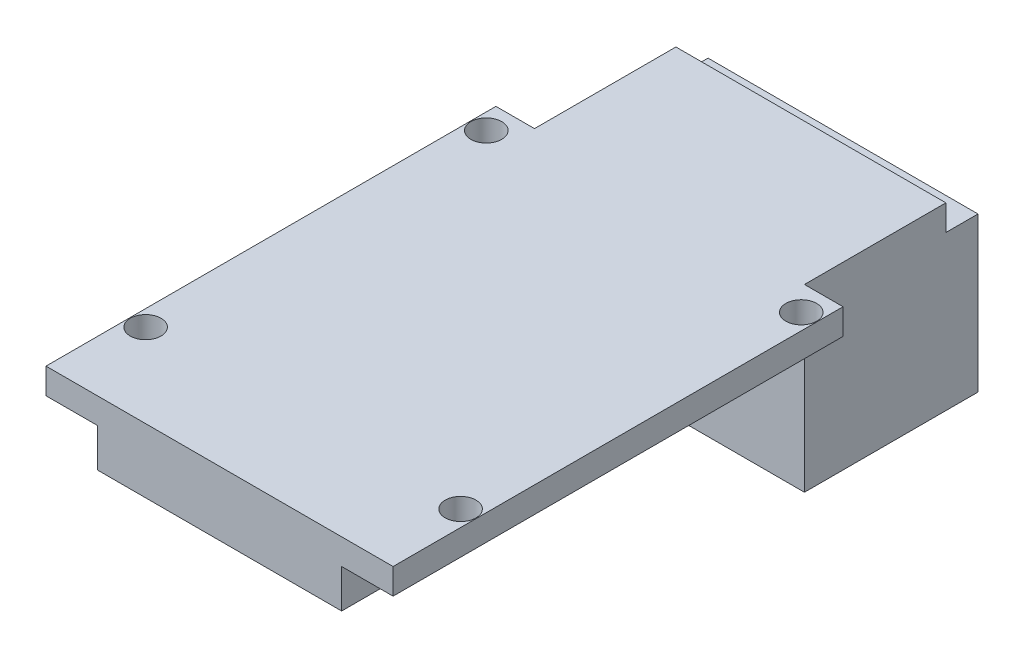
ISO-10303-21;
HEADER;
FILE_DESCRIPTION(('STEP AP214'),'2;1');
FILE_NAME('part.step','',(''),(''),'','','');
FILE_SCHEMA(('AUTOMOTIVE_DESIGN { 1 0 10303 214 1 1 1 1 }'));
ENDSEC;
DATA;
#1=APPLICATION_CONTEXT('core data for automotive mechanical design processes');
#2=APPLICATION_PROTOCOL_DEFINITION('international standard','automotive_design',2000,#1);
#3=PRODUCT_CONTEXT('',#1,'mechanical');
#4=PRODUCT('Part','Part','',(#3));
#5=PRODUCT_RELATED_PRODUCT_CATEGORY('part','',(#4));
#6=PRODUCT_DEFINITION_FORMATION('','',#4);
#7=PRODUCT_DEFINITION_CONTEXT('part definition',#1,'design');
#8=PRODUCT_DEFINITION('design','',#6,#7);
#9=PRODUCT_DEFINITION_SHAPE('','',#8);
#10=(LENGTH_UNIT() NAMED_UNIT(*) SI_UNIT(.MILLI.,.METRE.));
#11=(NAMED_UNIT(*) PLANE_ANGLE_UNIT() SI_UNIT($,.RADIAN.));
#12=(NAMED_UNIT(*) SI_UNIT($,.STERADIAN.) SOLID_ANGLE_UNIT());
#13=UNCERTAINTY_MEASURE_WITH_UNIT(LENGTH_MEASURE(1.E-05),#10,'distance_accuracy_value','');
#14=(GEOMETRIC_REPRESENTATION_CONTEXT(3) GLOBAL_UNCERTAINTY_ASSIGNED_CONTEXT((#13)) GLOBAL_UNIT_ASSIGNED_CONTEXT((#10,
#11,#12)) REPRESENTATION_CONTEXT('',''));
#15=CARTESIAN_POINT('',(0.,0.,0.));
#16=DIRECTION('',(0.,0.,1.));
#17=DIRECTION('',(1.,0.,0.));
#18=AXIS2_PLACEMENT_3D('',#15,#16,#17);
#19=CARTESIAN_POINT('',(0.,0.,0.));
#20=DIRECTION('',(0.,-1.,0.));
#21=DIRECTION('',(0.,0.,-1.));
#22=AXIS2_PLACEMENT_3D('',#19,#20,#21);
#23=PLANE('',#22);
#24=CARTESIAN_POINT('',(-3.27417051599355,0.,1.84748304207005));
#25=DIRECTION('',(0.,-1.,0.));
#26=DIRECTION('',(0.,0.,-1.));
#27=AXIS2_PLACEMENT_3D('',#24,#25,#26);
#28=CIRCLE('',#27,6.);
#29=CARTESIAN_POINT('',(-3.27417051599355,0.,-4.15251695792995));
#30=VERTEX_POINT('',#29);
#31=EDGE_CURVE('E380',#30,#30,#28,.T.);
#32=ORIENTED_EDGE('',*,*,#31,.F.);
#33=EDGE_LOOP('',(#32));
#34=FACE_BOUND('',#33,.T.);
#35=CARTESIAN_POINT('',(-12.25,0.,-15.5));
#36=DIRECTION('',(0.,1.,0.));
#37=DIRECTION('',(0.,0.,-1.));
#38=AXIS2_PLACEMENT_3D('',#35,#36,#37);
#39=CIRCLE('',#38,1.2);
#40=CARTESIAN_POINT('',(-12.25,0.,-16.7));
#41=VERTEX_POINT('',#40);
#42=EDGE_CURVE('E202',#41,#41,#39,.T.);
#43=ORIENTED_EDGE('',*,*,#42,.T.);
#44=EDGE_LOOP('',(#43));
#45=FACE_BOUND('',#44,.T.);
#46=CARTESIAN_POINT('',(12.25,0.,11.));
#47=DIRECTION('',(0.,1.,0.));
#48=DIRECTION('',(0.,0.,1.));
#49=AXIS2_PLACEMENT_3D('',#46,#47,#48);
#50=CIRCLE('',#49,1.2);
#51=CARTESIAN_POINT('',(12.25,0.,12.2));
#52=VERTEX_POINT('',#51);
#53=EDGE_CURVE('E214',#52,#52,#50,.T.);
#54=ORIENTED_EDGE('',*,*,#53,.T.);
#55=EDGE_LOOP('',(#54));
#56=FACE_BOUND('',#55,.T.);
#57=CARTESIAN_POINT('',(12.25,0.,-15.5));
#58=DIRECTION('',(0.,1.,0.));
#59=DIRECTION('',(0.,0.,1.));
#60=AXIS2_PLACEMENT_3D('',#57,#58,#59);
#61=CIRCLE('',#60,1.2);
#62=CARTESIAN_POINT('',(12.25,0.,-14.3));
#63=VERTEX_POINT('',#62);
#64=EDGE_CURVE('E208',#63,#63,#61,.T.);
#65=ORIENTED_EDGE('',*,*,#64,.T.);
#66=EDGE_LOOP('',(#65));
#67=FACE_BOUND('',#66,.T.);
#68=CARTESIAN_POINT('',(-12.25,0.,11.));
#69=DIRECTION('',(0.,1.,0.));
#70=DIRECTION('',(0.,0.,-1.));
#71=AXIS2_PLACEMENT_3D('',#68,#69,#70);
#72=CIRCLE('',#71,1.2);
#73=CARTESIAN_POINT('',(-12.25,0.,9.8));
#74=VERTEX_POINT('',#73);
#75=EDGE_CURVE('E198',#74,#74,#72,.T.);
#76=ORIENTED_EDGE('',*,*,#75,.T.);
#77=EDGE_LOOP('',(#76));
#78=FACE_BOUND('',#77,.T.);
#79=DIRECTION('',(1.,0.,0.));
#80=VECTOR('',#79,1.);
#81=CARTESIAN_POINT('',(9.5,0.,13.5));
#82=LINE('',#81,#80);
#83=CARTESIAN_POINT('',(-9.5,0.,13.5));
#84=VERTEX_POINT('',#83);
#85=CARTESIAN_POINT('',(9.5,0.,13.5));
#86=VERTEX_POINT('',#85);
#87=EDGE_CURVE('E375',#84,#86,#82,.T.);
#88=ORIENTED_EDGE('',*,*,#87,.F.);
#89=DIRECTION('',(0.,0.,-1.));
#90=VECTOR('',#89,1.);
#91=CARTESIAN_POINT('',(-9.5,0.,13.5));
#92=LINE('',#91,#90);
#93=CARTESIAN_POINT('',(-9.5,0.,17.5));
#94=VERTEX_POINT('',#93);
#95=EDGE_CURVE('E298',#94,#84,#92,.T.);
#96=ORIENTED_EDGE('',*,*,#95,.F.);
#97=DIRECTION('',(1.,0.,0.));
#98=VECTOR('',#97,1.);
#99=CARTESIAN_POINT('',(-13.5,0.,17.5));
#100=LINE('',#99,#98);
#101=CARTESIAN_POINT('',(-13.5,0.,17.5));
#102=VERTEX_POINT('',#101);
#103=EDGE_CURVE('E156',#102,#94,#100,.T.);
#104=ORIENTED_EDGE('',*,*,#103,.F.);
#105=DIRECTION('',(0.,0.,1.));
#106=VECTOR('',#105,1.);
#107=CARTESIAN_POINT('',(-13.5,0.,17.5));
#108=LINE('',#107,#106);
#109=CARTESIAN_POINT('',(-13.5,0.,-17.5));
#110=VERTEX_POINT('',#109);
#111=EDGE_CURVE('E154',#110,#102,#108,.T.);
#112=ORIENTED_EDGE('',*,*,#111,.F.);
#113=DIRECTION('',(-1.,0.,0.));
#114=VECTOR('',#113,1.);
#115=CARTESIAN_POINT('',(-13.5,0.,-17.5));
#116=LINE('',#115,#114);
#117=CARTESIAN_POINT('',(-10.5,0.,-17.5));
#118=VERTEX_POINT('',#117);
#119=EDGE_CURVE('E131',#118,#110,#116,.T.);
#120=ORIENTED_EDGE('',*,*,#119,.F.);
#121=DIRECTION('',(-1.,0.,0.));
#122=VECTOR('',#121,1.);
#123=CARTESIAN_POINT('',(10.5,0.,-17.5));
#124=LINE('',#123,#122);
#125=CARTESIAN_POINT('',(10.5,0.,-17.5));
#126=VERTEX_POINT('',#125);
#127=EDGE_CURVE('E183',#126,#118,#124,.T.);
#128=ORIENTED_EDGE('',*,*,#127,.F.);
#129=DIRECTION('',(-1.,0.,0.));
#130=VECTOR('',#129,1.);
#131=CARTESIAN_POINT('',(10.5,0.,-17.5));
#132=LINE('',#131,#130);
#133=CARTESIAN_POINT('',(13.5,0.,-17.5));
#134=VERTEX_POINT('',#133);
#135=EDGE_CURVE('E147',#134,#126,#132,.T.);
#136=ORIENTED_EDGE('',*,*,#135,.F.);
#137=DIRECTION('',(0.,0.,-1.));
#138=VECTOR('',#137,1.);
#139=CARTESIAN_POINT('',(13.5,0.,17.5));
#140=LINE('',#139,#138);
#141=CARTESIAN_POINT('',(13.5,0.,17.5));
#142=VERTEX_POINT('',#141);
#143=EDGE_CURVE('E144',#142,#134,#140,.T.);
#144=ORIENTED_EDGE('',*,*,#143,.F.);
#145=CARTESIAN_POINT('',(9.5,0.,17.5));
#146=VERTEX_POINT('',#145);
#147=EDGE_CURVE('E90',#146,#142,#100,.T.);
#148=ORIENTED_EDGE('',*,*,#147,.F.);
#149=DIRECTION('',(0.,0.,1.));
#150=VECTOR('',#149,1.);
#151=CARTESIAN_POINT('',(9.5,0.,13.5));
#152=LINE('',#151,#150);
#153=EDGE_CURVE('E294',#86,#146,#152,.T.);
#154=ORIENTED_EDGE('',*,*,#153,.F.);
#155=EDGE_LOOP('',(#88,#96,#104,#112,#120,#128,#136,#144,#148,#154));
#156=FACE_BOUND('',#155,.T.);
#157=ADVANCED_FACE('F39',(#34,#45,#56,#67,#78,#156),#23,.T.);
#158=CARTESIAN_POINT('',(0.,2.,0.));
#159=DIRECTION('',(0.,-1.,0.));
#160=DIRECTION('',(0.,0.,-1.));
#161=AXIS2_PLACEMENT_3D('',#158,#159,#160);
#162=PLANE('',#161);
#163=DIRECTION('',(0.,0.,-1.));
#164=VECTOR('',#163,1.);
#165=CARTESIAN_POINT('',(13.5,2.,17.5));
#166=LINE('',#165,#164);
#167=CARTESIAN_POINT('',(13.5,2.,17.5));
#168=VERTEX_POINT('',#167);
#169=CARTESIAN_POINT('',(13.5,2.,-17.5));
#170=VERTEX_POINT('',#169);
#171=EDGE_CURVE('E159',#168,#170,#166,.T.);
#172=ORIENTED_EDGE('',*,*,#171,.T.);
#173=DIRECTION('',(-1.,0.,0.));
#174=VECTOR('',#173,1.);
#175=CARTESIAN_POINT('',(10.5,2.,-17.5));
#176=LINE('',#175,#174);
#177=CARTESIAN_POINT('',(10.5,2.,-17.5));
#178=VERTEX_POINT('',#177);
#179=EDGE_CURVE('E98',#170,#178,#176,.T.);
#180=ORIENTED_EDGE('',*,*,#179,.T.);
#181=DIRECTION('',(0.,0.,-1.));
#182=VECTOR('',#181,1.);
#183=CARTESIAN_POINT('',(10.5,2.,-28.5));
#184=LINE('',#183,#182);
#185=CARTESIAN_POINT('',(10.5,2.,-28.5));
#186=VERTEX_POINT('',#185);
#187=EDGE_CURVE('E178',#178,#186,#184,.T.);
#188=ORIENTED_EDGE('',*,*,#187,.T.);
#189=DIRECTION('',(-1.,0.,0.));
#190=VECTOR('',#189,1.);
#191=CARTESIAN_POINT('',(-10.5,2.,-28.5));
#192=LINE('',#191,#190);
#193=CARTESIAN_POINT('',(-10.5,2.,-28.5));
#194=VERTEX_POINT('',#193);
#195=EDGE_CURVE('E224',#186,#194,#192,.T.);
#196=ORIENTED_EDGE('',*,*,#195,.T.);
#197=DIRECTION('',(0.,0.,1.));
#198=VECTOR('',#197,1.);
#199=CARTESIAN_POINT('',(-10.5,2.,-28.5));
#200=LINE('',#199,#198);
#201=CARTESIAN_POINT('',(-10.5,2.,-17.5));
#202=VERTEX_POINT('',#201);
#203=EDGE_CURVE('E122',#194,#202,#200,.T.);
#204=ORIENTED_EDGE('',*,*,#203,.T.);
#205=DIRECTION('',(-1.,0.,0.));
#206=VECTOR('',#205,1.);
#207=CARTESIAN_POINT('',(-13.5,2.,-17.5));
#208=LINE('',#207,#206);
#209=CARTESIAN_POINT('',(-13.5,2.,-17.5));
#210=VERTEX_POINT('',#209);
#211=EDGE_CURVE('E114',#202,#210,#208,.T.);
#212=ORIENTED_EDGE('',*,*,#211,.T.);
#213=DIRECTION('',(0.,0.,1.));
#214=VECTOR('',#213,1.);
#215=CARTESIAN_POINT('',(-13.5,2.,17.5));
#216=LINE('',#215,#214);
#217=CARTESIAN_POINT('',(-13.5,2.,17.5));
#218=VERTEX_POINT('',#217);
#219=EDGE_CURVE('E119',#210,#218,#216,.T.);
#220=ORIENTED_EDGE('',*,*,#219,.T.);
#221=DIRECTION('',(1.,0.,0.));
#222=VECTOR('',#221,1.);
#223=CARTESIAN_POINT('',(-13.5,2.,17.5));
#224=LINE('',#223,#222);
#225=EDGE_CURVE('E63',#218,#168,#224,.T.);
#226=ORIENTED_EDGE('',*,*,#225,.T.);
#227=EDGE_LOOP('',(#172,#180,#188,#196,#204,#212,#220,#226));
#228=FACE_BOUND('',#227,.T.);
#229=CARTESIAN_POINT('',(12.25,2.,11.));
#230=DIRECTION('',(0.,1.,0.));
#231=DIRECTION('',(0.,0.,1.));
#232=AXIS2_PLACEMENT_3D('',#229,#230,#231);
#233=CIRCLE('',#232,1.2);
#234=CARTESIAN_POINT('',(12.25,2.,12.2));
#235=VERTEX_POINT('',#234);
#236=EDGE_CURVE('E148',#235,#235,#233,.T.);
#237=ORIENTED_EDGE('',*,*,#236,.F.);
#238=EDGE_LOOP('',(#237));
#239=FACE_BOUND('',#238,.T.);
#240=CARTESIAN_POINT('',(12.25,2.,-15.5));
#241=DIRECTION('',(0.,1.,0.));
#242=DIRECTION('',(0.,0.,1.));
#243=AXIS2_PLACEMENT_3D('',#240,#241,#242);
#244=CIRCLE('',#243,1.2);
#245=CARTESIAN_POINT('',(12.25,2.,-14.3));
#246=VERTEX_POINT('',#245);
#247=EDGE_CURVE('E211',#246,#246,#244,.T.);
#248=ORIENTED_EDGE('',*,*,#247,.F.);
#249=EDGE_LOOP('',(#248));
#250=FACE_BOUND('',#249,.T.);
#251=CARTESIAN_POINT('',(-12.25,2.,-15.5));
#252=DIRECTION('',(0.,1.,0.));
#253=DIRECTION('',(0.,0.,-1.));
#254=AXIS2_PLACEMENT_3D('',#251,#252,#253);
#255=CIRCLE('',#254,1.2);
#256=CARTESIAN_POINT('',(-12.25,2.,-16.7));
#257=VERTEX_POINT('',#256);
#258=EDGE_CURVE('E205',#257,#257,#255,.T.);
#259=ORIENTED_EDGE('',*,*,#258,.F.);
#260=EDGE_LOOP('',(#259));
#261=FACE_BOUND('',#260,.T.);
#262=CARTESIAN_POINT('',(-12.25,2.,11.));
#263=DIRECTION('',(0.,1.,0.));
#264=DIRECTION('',(0.,0.,-1.));
#265=AXIS2_PLACEMENT_3D('',#262,#263,#264);
#266=CIRCLE('',#265,1.2);
#267=CARTESIAN_POINT('',(-12.25,2.,9.8));
#268=VERTEX_POINT('',#267);
#269=EDGE_CURVE('E199',#268,#268,#266,.T.);
#270=ORIENTED_EDGE('',*,*,#269,.F.);
#271=EDGE_LOOP('',(#270));
#272=FACE_BOUND('',#271,.T.);
#273=ADVANCED_FACE('F116',(#228,#239,#250,#261,#272),#162,.F.);
#274=CARTESIAN_POINT('',(13.5,2.,17.5));
#275=DIRECTION('',(-1.,0.,0.));
#276=DIRECTION('',(0.,0.,1.));
#277=AXIS2_PLACEMENT_3D('',#274,#275,#276);
#278=PLANE('',#277);
#279=ORIENTED_EDGE('',*,*,#143,.T.);
#280=DIRECTION('',(0.,-1.,0.));
#281=VECTOR('',#280,1.);
#282=CARTESIAN_POINT('',(13.5,2.,-17.5));
#283=LINE('',#282,#281);
#284=EDGE_CURVE('E11',#170,#134,#283,.T.);
#285=ORIENTED_EDGE('',*,*,#284,.F.);
#286=ORIENTED_EDGE('',*,*,#171,.F.);
#287=DIRECTION('',(0.,-1.,0.));
#288=VECTOR('',#287,1.);
#289=CARTESIAN_POINT('',(13.5,2.,17.5));
#290=LINE('',#289,#288);
#291=EDGE_CURVE('E140',#168,#142,#290,.T.);
#292=ORIENTED_EDGE('',*,*,#291,.T.);
#293=EDGE_LOOP('',(#279,#285,#286,#292));
#294=FACE_BOUND('',#293,.T.);
#295=ADVANCED_FACE('F41',(#294),#278,.F.);
#296=CARTESIAN_POINT('',(10.5,2.,-17.5));
#297=DIRECTION('',(0.,0.,1.));
#298=DIRECTION('',(1.,0.,0.));
#299=AXIS2_PLACEMENT_3D('',#296,#297,#298);
#300=PLANE('',#299);
#301=ORIENTED_EDGE('',*,*,#135,.T.);
#302=DIRECTION('',(0.,-1.,0.));
#303=VECTOR('',#302,1.);
#304=CARTESIAN_POINT('',(10.5,2.,-17.5));
#305=LINE('',#304,#303);
#306=EDGE_CURVE('E47',#178,#126,#305,.T.);
#307=ORIENTED_EDGE('',*,*,#306,.F.);
#308=ORIENTED_EDGE('',*,*,#179,.F.);
#309=ORIENTED_EDGE('',*,*,#284,.T.);
#310=EDGE_LOOP('',(#301,#307,#308,#309));
#311=FACE_BOUND('',#310,.T.);
#312=ADVANCED_FACE('F364',(#311),#300,.F.);
#313=CARTESIAN_POINT('',(10.5,2.,-28.5));
#314=DIRECTION('',(-1.,0.,0.));
#315=DIRECTION('',(0.,0.,1.));
#316=AXIS2_PLACEMENT_3D('',#313,#314,#315);
#317=PLANE('',#316);
#318=ORIENTED_EDGE('',*,*,#306,.T.);
#319=DIRECTION('',(0.,1.,0.));
#320=VECTOR('',#319,1.);
#321=CARTESIAN_POINT('',(10.5,-12.,-17.5));
#322=LINE('',#321,#320);
#323=CARTESIAN_POINT('',(10.5,-12.,-17.5));
#324=VERTEX_POINT('',#323);
#325=EDGE_CURVE('E175',#324,#126,#322,.T.);
#326=ORIENTED_EDGE('',*,*,#325,.F.);
#327=DIRECTION('',(0.,0.,1.));
#328=VECTOR('',#327,1.);
#329=CARTESIAN_POINT('',(10.5,-12.,-31.));
#330=LINE('',#329,#328);
#331=CARTESIAN_POINT('',(10.5,-12.,-31.));
#332=VERTEX_POINT('',#331);
#333=EDGE_CURVE('E316',#332,#324,#330,.T.);
#334=ORIENTED_EDGE('',*,*,#333,.F.);
#335=DIRECTION('',(0.,1.,0.));
#336=VECTOR('',#335,1.);
#337=CARTESIAN_POINT('',(10.5,-12.,-31.));
#338=LINE('',#337,#336);
#339=CARTESIAN_POINT('',(10.5,0.,-31.));
#340=VERTEX_POINT('',#339);
#341=EDGE_CURVE('E187',#332,#340,#338,.T.);
#342=ORIENTED_EDGE('',*,*,#341,.T.);
#343=DIRECTION('',(0.,0.,1.));
#344=VECTOR('',#343,1.);
#345=CARTESIAN_POINT('',(10.5,0.,-31.));
#346=LINE('',#345,#344);
#347=CARTESIAN_POINT('',(10.5,0.,-28.5));
#348=VERTEX_POINT('',#347);
#349=EDGE_CURVE('E321',#340,#348,#346,.T.);
#350=ORIENTED_EDGE('',*,*,#349,.T.);
#351=DIRECTION('',(0.,-1.,0.));
#352=VECTOR('',#351,1.);
#353=CARTESIAN_POINT('',(10.5,2.,-28.5));
#354=LINE('',#353,#352);
#355=EDGE_CURVE('E166',#186,#348,#354,.T.);
#356=ORIENTED_EDGE('',*,*,#355,.F.);
#357=ORIENTED_EDGE('',*,*,#187,.F.);
#358=EDGE_LOOP('',(#318,#326,#334,#342,#350,#356,#357));
#359=FACE_BOUND('',#358,.T.);
#360=ADVANCED_FACE('F172',(#359),#317,.F.);
#361=CARTESIAN_POINT('',(-10.5,2.,-28.5));
#362=DIRECTION('',(0.,0.,1.));
#363=DIRECTION('',(1.,0.,0.));
#364=AXIS2_PLACEMENT_3D('',#361,#362,#363);
#365=PLANE('',#364);
#366=DIRECTION('',(-1.,0.,0.));
#367=VECTOR('',#366,1.);
#368=CARTESIAN_POINT('',(-10.5,0.,-28.5));
#369=LINE('',#368,#367);
#370=CARTESIAN_POINT('',(-10.5,0.,-28.5));
#371=VERTEX_POINT('',#370);
#372=EDGE_CURVE('E151',#348,#371,#369,.T.);
#373=ORIENTED_EDGE('',*,*,#372,.T.);
#374=DIRECTION('',(0.,-1.,0.));
#375=VECTOR('',#374,1.);
#376=CARTESIAN_POINT('',(-10.5,2.,-28.5));
#377=LINE('',#376,#375);
#378=EDGE_CURVE('E163',#194,#371,#377,.T.);
#379=ORIENTED_EDGE('',*,*,#378,.F.);
#380=ORIENTED_EDGE('',*,*,#195,.F.);
#381=ORIENTED_EDGE('',*,*,#355,.T.);
#382=EDGE_LOOP('',(#373,#379,#380,#381));
#383=FACE_BOUND('',#382,.T.);
#384=ADVANCED_FACE('F228',(#383),#365,.F.);
#385=CARTESIAN_POINT('',(-10.5,2.,-28.5));
#386=DIRECTION('',(1.,0.,0.));
#387=DIRECTION('',(0.,0.,-1.));
#388=AXIS2_PLACEMENT_3D('',#385,#386,#387);
#389=PLANE('',#388);
#390=ORIENTED_EDGE('',*,*,#378,.T.);
#391=DIRECTION('',(0.,0.,-1.));
#392=VECTOR('',#391,1.);
#393=CARTESIAN_POINT('',(-10.5,0.,-31.));
#394=LINE('',#393,#392);
#395=CARTESIAN_POINT('',(-10.5,0.,-31.));
#396=VERTEX_POINT('',#395);
#397=EDGE_CURVE('E309',#371,#396,#394,.T.);
#398=ORIENTED_EDGE('',*,*,#397,.T.);
#399=DIRECTION('',(0.,1.,0.));
#400=VECTOR('',#399,1.);
#401=CARTESIAN_POINT('',(-10.5,-12.,-31.));
#402=LINE('',#401,#400);
#403=CARTESIAN_POINT('',(-10.5,-12.,-31.));
#404=VERTEX_POINT('',#403);
#405=EDGE_CURVE('E191',#404,#396,#402,.T.);
#406=ORIENTED_EDGE('',*,*,#405,.F.);
#407=DIRECTION('',(0.,0.,-1.));
#408=VECTOR('',#407,1.);
#409=CARTESIAN_POINT('',(-10.5,-12.,-31.));
#410=LINE('',#409,#408);
#411=CARTESIAN_POINT('',(-10.5,-12.,-17.5));
#412=VERTEX_POINT('',#411);
#413=EDGE_CURVE('E311',#412,#404,#410,.T.);
#414=ORIENTED_EDGE('',*,*,#413,.F.);
#415=DIRECTION('',(0.,1.,0.));
#416=VECTOR('',#415,1.);
#417=CARTESIAN_POINT('',(-10.5,-12.,-17.5));
#418=LINE('',#417,#416);
#419=EDGE_CURVE('E188',#412,#118,#418,.T.);
#420=ORIENTED_EDGE('',*,*,#419,.T.);
#421=DIRECTION('',(0.,-1.,0.));
#422=VECTOR('',#421,1.);
#423=CARTESIAN_POINT('',(-10.5,2.,-17.5));
#424=LINE('',#423,#422);
#425=EDGE_CURVE('E134',#202,#118,#424,.T.);
#426=ORIENTED_EDGE('',*,*,#425,.F.);
#427=ORIENTED_EDGE('',*,*,#203,.F.);
#428=EDGE_LOOP('',(#390,#398,#406,#414,#420,#426,#427));
#429=FACE_BOUND('',#428,.T.);
#430=ADVANCED_FACE('F233',(#429),#389,.F.);
#431=CARTESIAN_POINT('',(-13.5,2.,-17.5));
#432=DIRECTION('',(0.,0.,1.));
#433=DIRECTION('',(1.,0.,0.));
#434=AXIS2_PLACEMENT_3D('',#431,#432,#433);
#435=PLANE('',#434);
#436=ORIENTED_EDGE('',*,*,#119,.T.);
#437=DIRECTION('',(0.,-1.,0.));
#438=VECTOR('',#437,1.);
#439=CARTESIAN_POINT('',(-13.5,2.,-17.5));
#440=LINE('',#439,#438);
#441=EDGE_CURVE('E128',#210,#110,#440,.T.);
#442=ORIENTED_EDGE('',*,*,#441,.F.);
#443=ORIENTED_EDGE('',*,*,#211,.F.);
#444=ORIENTED_EDGE('',*,*,#425,.T.);
#445=EDGE_LOOP('',(#436,#442,#443,#444));
#446=FACE_BOUND('',#445,.T.);
#447=ADVANCED_FACE('F129',(#446),#435,.F.);
#448=CARTESIAN_POINT('',(-13.5,2.,17.5));
#449=DIRECTION('',(1.,0.,0.));
#450=DIRECTION('',(0.,0.,-1.));
#451=AXIS2_PLACEMENT_3D('',#448,#449,#450);
#452=PLANE('',#451);
#453=ORIENTED_EDGE('',*,*,#111,.T.);
#454=DIRECTION('',(0.,-1.,0.));
#455=VECTOR('',#454,1.);
#456=CARTESIAN_POINT('',(-13.5,2.,17.5));
#457=LINE('',#456,#455);
#458=EDGE_CURVE('E135',#218,#102,#457,.T.);
#459=ORIENTED_EDGE('',*,*,#458,.F.);
#460=ORIENTED_EDGE('',*,*,#219,.F.);
#461=ORIENTED_EDGE('',*,*,#441,.T.);
#462=EDGE_LOOP('',(#453,#459,#460,#461));
#463=FACE_BOUND('',#462,.T.);
#464=ADVANCED_FACE('F137',(#463),#452,.F.);
#465=CARTESIAN_POINT('',(-13.5,2.,17.5));
#466=DIRECTION('',(0.,0.,-1.));
#467=DIRECTION('',(-1.,0.,0.));
#468=AXIS2_PLACEMENT_3D('',#465,#466,#467);
#469=PLANE('',#468);
#470=ORIENTED_EDGE('',*,*,#103,.T.);
#471=DIRECTION('',(0.,1.,0.));
#472=VECTOR('',#471,1.);
#473=CARTESIAN_POINT('',(-9.5,-3.,17.5));
#474=LINE('',#473,#472);
#475=CARTESIAN_POINT('',(-9.5,-3.,17.5));
#476=VERTEX_POINT('',#475);
#477=EDGE_CURVE('E386',#476,#94,#474,.T.);
#478=ORIENTED_EDGE('',*,*,#477,.F.);
#479=DIRECTION('',(-1.,0.,0.));
#480=VECTOR('',#479,1.);
#481=CARTESIAN_POINT('',(9.5,-3.,17.5));
#482=LINE('',#481,#480);
#483=CARTESIAN_POINT('',(9.5,-3.,17.5));
#484=VERTEX_POINT('',#483);
#485=EDGE_CURVE('E291',#484,#476,#482,.T.);
#486=ORIENTED_EDGE('',*,*,#485,.F.);
#487=DIRECTION('',(0.,1.,0.));
#488=VECTOR('',#487,1.);
#489=CARTESIAN_POINT('',(9.5,-3.,17.5));
#490=LINE('',#489,#488);
#491=EDGE_CURVE('E54',#484,#146,#490,.T.);
#492=ORIENTED_EDGE('',*,*,#491,.T.);
#493=ORIENTED_EDGE('',*,*,#147,.T.);
#494=ORIENTED_EDGE('',*,*,#291,.F.);
#495=ORIENTED_EDGE('',*,*,#225,.F.);
#496=ORIENTED_EDGE('',*,*,#458,.T.);
#497=EDGE_LOOP('',(#470,#478,#486,#492,#493,#494,#495,#496));
#498=FACE_BOUND('',#497,.T.);
#499=ADVANCED_FACE('F351',(#498),#469,.F.);
#500=CARTESIAN_POINT('',(12.25,2.,11.));
#501=DIRECTION('',(0.,-1.,0.));
#502=DIRECTION('',(0.,0.,-1.));
#503=AXIS2_PLACEMENT_3D('',#500,#501,#502);
#504=CYLINDRICAL_SURFACE('',#503,1.2);
#505=ORIENTED_EDGE('',*,*,#236,.T.);
#506=EDGE_LOOP('',(#505));
#507=FACE_BOUND('',#506,.T.);
#508=ORIENTED_EDGE('',*,*,#53,.F.);
#509=EDGE_LOOP('',(#508));
#510=FACE_BOUND('',#509,.T.);
#511=ADVANCED_FACE('F354',(#507,#510),#504,.F.);
#512=CARTESIAN_POINT('',(12.25,2.,-15.5));
#513=DIRECTION('',(0.,-1.,0.));
#514=DIRECTION('',(0.,0.,-1.));
#515=AXIS2_PLACEMENT_3D('',#512,#513,#514);
#516=CYLINDRICAL_SURFACE('',#515,1.2);
#517=ORIENTED_EDGE('',*,*,#247,.T.);
#518=EDGE_LOOP('',(#517));
#519=FACE_BOUND('',#518,.T.);
#520=ORIENTED_EDGE('',*,*,#64,.F.);
#521=EDGE_LOOP('',(#520));
#522=FACE_BOUND('',#521,.T.);
#523=ADVANCED_FACE('F435',(#519,#522),#516,.F.);
#524=CARTESIAN_POINT('',(-12.25,2.,-15.5));
#525=DIRECTION('',(0.,-1.,0.));
#526=DIRECTION('',(0.,0.,-1.));
#527=AXIS2_PLACEMENT_3D('',#524,#525,#526);
#528=CYLINDRICAL_SURFACE('',#527,1.2);
#529=ORIENTED_EDGE('',*,*,#258,.T.);
#530=EDGE_LOOP('',(#529));
#531=FACE_BOUND('',#530,.T.);
#532=ORIENTED_EDGE('',*,*,#42,.F.);
#533=EDGE_LOOP('',(#532));
#534=FACE_BOUND('',#533,.T.);
#535=ADVANCED_FACE('F429',(#531,#534),#528,.F.);
#536=CARTESIAN_POINT('',(-12.25,2.,11.));
#537=DIRECTION('',(0.,-1.,0.));
#538=DIRECTION('',(0.,0.,-1.));
#539=AXIS2_PLACEMENT_3D('',#536,#537,#538);
#540=CYLINDRICAL_SURFACE('',#539,1.2);
#541=ORIENTED_EDGE('',*,*,#269,.T.);
#542=EDGE_LOOP('',(#541));
#543=FACE_BOUND('',#542,.T.);
#544=ORIENTED_EDGE('',*,*,#75,.F.);
#545=EDGE_LOOP('',(#544));
#546=FACE_BOUND('',#545,.T.);
#547=ADVANCED_FACE('F424',(#543,#546),#540,.F.);
#548=CARTESIAN_POINT('',(10.5,-12.,-31.));
#549=DIRECTION('',(0.,0.,1.));
#550=DIRECTION('',(1.,0.,0.));
#551=AXIS2_PLACEMENT_3D('',#548,#549,#550);
#552=PLANE('',#551);
#553=CARTESIAN_POINT('',(0.,-6.,-31.));
#554=DIRECTION('',(0.,0.,-1.));
#555=DIRECTION('',(-1.,0.,0.));
#556=AXIS2_PLACEMENT_3D('',#553,#554,#555);
#557=CIRCLE('',#556,4.);
#558=CARTESIAN_POINT('',(-3.99999999999999,-6.,-31.));
#559=VERTEX_POINT('',#558);
#560=EDGE_CURVE('E300',#559,#559,#557,.T.);
#561=ORIENTED_EDGE('',*,*,#560,.F.);
#562=EDGE_LOOP('',(#561));
#563=FACE_BOUND('',#562,.T.);
#564=DIRECTION('',(1.,0.,0.));
#565=VECTOR('',#564,1.);
#566=CARTESIAN_POINT('',(10.5,0.,-31.));
#567=LINE('',#566,#565);
#568=EDGE_CURVE('E246',#396,#340,#567,.T.);
#569=ORIENTED_EDGE('',*,*,#568,.T.);
#570=ORIENTED_EDGE('',*,*,#341,.F.);
#571=DIRECTION('',(1.,0.,0.));
#572=VECTOR('',#571,1.);
#573=CARTESIAN_POINT('',(10.5,-12.,-31.));
#574=LINE('',#573,#572);
#575=EDGE_CURVE('E314',#404,#332,#574,.T.);
#576=ORIENTED_EDGE('',*,*,#575,.F.);
#577=ORIENTED_EDGE('',*,*,#405,.T.);
#578=EDGE_LOOP('',(#569,#570,#576,#577));
#579=FACE_BOUND('',#578,.T.);
#580=ADVANCED_FACE('F327',(#563,#579),#552,.F.);
#581=CARTESIAN_POINT('',(10.5,-12.,-17.5));
#582=DIRECTION('',(0.,0.,-1.));
#583=DIRECTION('',(-1.,0.,0.));
#584=AXIS2_PLACEMENT_3D('',#581,#582,#583);
#585=PLANE('',#584);
#586=ORIENTED_EDGE('',*,*,#127,.T.);
#587=ORIENTED_EDGE('',*,*,#419,.F.);
#588=DIRECTION('',(-1.,0.,0.));
#589=VECTOR('',#588,1.);
#590=CARTESIAN_POINT('',(10.5,-12.,-17.5));
#591=LINE('',#590,#589);
#592=EDGE_CURVE('E186',#324,#412,#591,.T.);
#593=ORIENTED_EDGE('',*,*,#592,.F.);
#594=ORIENTED_EDGE('',*,*,#325,.T.);
#595=EDGE_LOOP('',(#586,#587,#593,#594));
#596=FACE_BOUND('',#595,.T.);
#597=ADVANCED_FACE('F181',(#596),#585,.F.);
#598=CARTESIAN_POINT('',(0.,-12.,0.));
#599=DIRECTION('',(0.,-1.,0.));
#600=DIRECTION('',(0.,0.,-1.));
#601=AXIS2_PLACEMENT_3D('',#598,#599,#600);
#602=PLANE('',#601);
#603=ORIENTED_EDGE('',*,*,#413,.T.);
#604=ORIENTED_EDGE('',*,*,#575,.T.);
#605=ORIENTED_EDGE('',*,*,#333,.T.);
#606=ORIENTED_EDGE('',*,*,#592,.T.);
#607=EDGE_LOOP('',(#603,#604,#605,#606));
#608=FACE_BOUND('',#607,.T.);
#609=ADVANCED_FACE('F329',(#608),#602,.T.);
#610=CARTESIAN_POINT('',(0.,0.,0.));
#611=DIRECTION('',(0.,-1.,0.));
#612=DIRECTION('',(0.,0.,-1.));
#613=AXIS2_PLACEMENT_3D('',#610,#611,#612);
#614=PLANE('',#613);
#615=ORIENTED_EDGE('',*,*,#372,.F.);
#616=ORIENTED_EDGE('',*,*,#349,.F.);
#617=ORIENTED_EDGE('',*,*,#568,.F.);
#618=ORIENTED_EDGE('',*,*,#397,.F.);
#619=EDGE_LOOP('',(#615,#616,#617,#618));
#620=FACE_BOUND('',#619,.T.);
#621=ADVANCED_FACE('F325',(#620),#614,.F.);
#622=CARTESIAN_POINT('',(0.,-6.,-27.));
#623=DIRECTION('',(0.,0.,-1.));
#624=DIRECTION('',(-1.,0.,0.));
#625=AXIS2_PLACEMENT_3D('',#622,#623,#624);
#626=CYLINDRICAL_SURFACE('',#625,4.);
#627=CARTESIAN_POINT('',(0.,-6.,-27.));
#628=DIRECTION('',(0.,0.,-1.));
#629=DIRECTION('',(-1.,0.,0.));
#630=AXIS2_PLACEMENT_3D('',#627,#628,#629);
#631=CIRCLE('',#630,4.);
#632=CARTESIAN_POINT('',(-4.,-6.,-27.));
#633=VERTEX_POINT('',#632);
#634=EDGE_CURVE('E303',#633,#633,#631,.T.);
#635=ORIENTED_EDGE('',*,*,#634,.F.);
#636=EDGE_LOOP('',(#635));
#637=FACE_BOUND('',#636,.T.);
#638=ORIENTED_EDGE('',*,*,#560,.T.);
#639=EDGE_LOOP('',(#638));
#640=FACE_BOUND('',#639,.T.);
#641=ADVANCED_FACE('F336',(#637,#640),#626,.F.);
#642=CARTESIAN_POINT('',(0.,-6.,-27.));
#643=DIRECTION('',(0.,0.,-1.));
#644=DIRECTION('',(-1.,0.,0.));
#645=AXIS2_PLACEMENT_3D('',#642,#643,#644);
#646=PLANE('',#645);
#647=ORIENTED_EDGE('',*,*,#634,.T.);
#648=EDGE_LOOP('',(#647));
#649=FACE_BOUND('',#648,.T.);
#650=ADVANCED_FACE('F412',(#649),#646,.T.);
#651=CARTESIAN_POINT('',(-9.5,-3.,13.5));
#652=DIRECTION('',(1.,0.,0.));
#653=DIRECTION('',(0.,0.,-1.));
#654=AXIS2_PLACEMENT_3D('',#651,#652,#653);
#655=PLANE('',#654);
#656=ORIENTED_EDGE('',*,*,#95,.T.);
#657=DIRECTION('',(0.,1.,0.));
#658=VECTOR('',#657,1.);
#659=CARTESIAN_POINT('',(-9.5,-3.,13.5));
#660=LINE('',#659,#658);
#661=CARTESIAN_POINT('',(-9.5,-3.,13.5));
#662=VERTEX_POINT('',#661);
#663=EDGE_CURVE('E280',#662,#84,#660,.T.);
#664=ORIENTED_EDGE('',*,*,#663,.F.);
#665=DIRECTION('',(0.,0.,-1.));
#666=VECTOR('',#665,1.);
#667=CARTESIAN_POINT('',(-9.5,-3.,13.5));
#668=LINE('',#667,#666);
#669=EDGE_CURVE('E287',#476,#662,#668,.T.);
#670=ORIENTED_EDGE('',*,*,#669,.F.);
#671=ORIENTED_EDGE('',*,*,#477,.T.);
#672=EDGE_LOOP('',(#656,#664,#670,#671));
#673=FACE_BOUND('',#672,.T.);
#674=ADVANCED_FACE('F296',(#673),#655,.F.);
#675=CARTESIAN_POINT('',(9.5,-3.,13.5));
#676=DIRECTION('',(0.,0.,1.));
#677=DIRECTION('',(1.,0.,0.));
#678=AXIS2_PLACEMENT_3D('',#675,#676,#677);
#679=PLANE('',#678);
#680=ORIENTED_EDGE('',*,*,#87,.T.);
#681=DIRECTION('',(0.,1.,0.));
#682=VECTOR('',#681,1.);
#683=CARTESIAN_POINT('',(9.5,-3.,13.5));
#684=LINE('',#683,#682);
#685=CARTESIAN_POINT('',(9.5,-3.,13.5));
#686=VERTEX_POINT('',#685);
#687=EDGE_CURVE('E283',#686,#86,#684,.T.);
#688=ORIENTED_EDGE('',*,*,#687,.F.);
#689=DIRECTION('',(1.,0.,0.));
#690=VECTOR('',#689,1.);
#691=CARTESIAN_POINT('',(9.5,-3.,13.5));
#692=LINE('',#691,#690);
#693=EDGE_CURVE('E276',#662,#686,#692,.T.);
#694=ORIENTED_EDGE('',*,*,#693,.F.);
#695=ORIENTED_EDGE('',*,*,#663,.T.);
#696=EDGE_LOOP('',(#680,#688,#694,#695));
#697=FACE_BOUND('',#696,.T.);
#698=ADVANCED_FACE('F278',(#697),#679,.F.);
#699=CARTESIAN_POINT('',(9.5,-3.,13.5));
#700=DIRECTION('',(-1.,0.,0.));
#701=DIRECTION('',(0.,0.,1.));
#702=AXIS2_PLACEMENT_3D('',#699,#700,#701);
#703=PLANE('',#702);
#704=ORIENTED_EDGE('',*,*,#153,.T.);
#705=ORIENTED_EDGE('',*,*,#491,.F.);
#706=DIRECTION('',(0.,0.,1.));
#707=VECTOR('',#706,1.);
#708=CARTESIAN_POINT('',(9.5,-3.,13.5));
#709=LINE('',#708,#707);
#710=EDGE_CURVE('E286',#686,#484,#709,.T.);
#711=ORIENTED_EDGE('',*,*,#710,.F.);
#712=ORIENTED_EDGE('',*,*,#687,.T.);
#713=EDGE_LOOP('',(#704,#705,#711,#712));
#714=FACE_BOUND('',#713,.T.);
#715=ADVANCED_FACE('F401',(#714),#703,.F.);
#716=CARTESIAN_POINT('',(0.,-3.,0.));
#717=DIRECTION('',(0.,-1.,0.));
#718=DIRECTION('',(0.,0.,-1.));
#719=AXIS2_PLACEMENT_3D('',#716,#717,#718);
#720=PLANE('',#719);
#721=ORIENTED_EDGE('',*,*,#669,.T.);
#722=ORIENTED_EDGE('',*,*,#693,.T.);
#723=ORIENTED_EDGE('',*,*,#710,.T.);
#724=ORIENTED_EDGE('',*,*,#485,.T.);
#725=EDGE_LOOP('',(#721,#722,#723,#724));
#726=FACE_BOUND('',#725,.T.);
#727=ADVANCED_FACE('F290',(#726),#720,.T.);
#728=CARTESIAN_POINT('',(-3.27417051599355,-5.,1.84748304207005));
#729=DIRECTION('',(0.,1.,0.));
#730=DIRECTION('',(0.,0.,1.));
#731=AXIS2_PLACEMENT_3D('',#728,#729,#730);
#732=CYLINDRICAL_SURFACE('',#731,6.);
#733=CARTESIAN_POINT('',(-3.27417051599355,-5.,1.84748304207005));
#734=DIRECTION('',(0.,-1.,0.));
#735=DIRECTION('',(0.,0.,-1.));
#736=AXIS2_PLACEMENT_3D('',#733,#734,#735);
#737=CIRCLE('',#736,6.);
#738=CARTESIAN_POINT('',(-3.27417051599355,-5.,-4.15251695792995));
#739=VERTEX_POINT('',#738);
#740=EDGE_CURVE('E376',#739,#739,#737,.T.);
#741=ORIENTED_EDGE('',*,*,#740,.F.);
#742=EDGE_LOOP('',(#741));
#743=FACE_BOUND('',#742,.T.);
#744=ORIENTED_EDGE('',*,*,#31,.T.);
#745=EDGE_LOOP('',(#744));
#746=FACE_BOUND('',#745,.T.);
#747=ADVANCED_FACE('F390',(#743,#746),#732,.T.);
#748=CARTESIAN_POINT('',(-3.27417051599355,-5.,1.84748304207005));
#749=DIRECTION('',(0.,-1.,0.));
#750=DIRECTION('',(0.,0.,-1.));
#751=AXIS2_PLACEMENT_3D('',#748,#749,#750);
#752=PLANE('',#751);
#753=ORIENTED_EDGE('',*,*,#740,.T.);
#754=EDGE_LOOP('',(#753));
#755=FACE_BOUND('',#754,.T.);
#756=ADVANCED_FACE('F392',(#755),#752,.T.);
#757=CLOSED_SHELL('',(#157,#273,#295,#312,#360,#384,#430,#447,#464,#499,#511,#523,#535,#547,
#580,#597,#609,#621,#641,#650,#674,#698,#715,#727,#747,#756));
#758=MANIFOLD_SOLID_BREP('B2',#757);
#759=ADVANCED_BREP_SHAPE_REPRESENTATION('',(#18,#758),#14);
#760=SHAPE_DEFINITION_REPRESENTATION(#9,#759);
ENDSEC;
END-ISO-10303-21;
